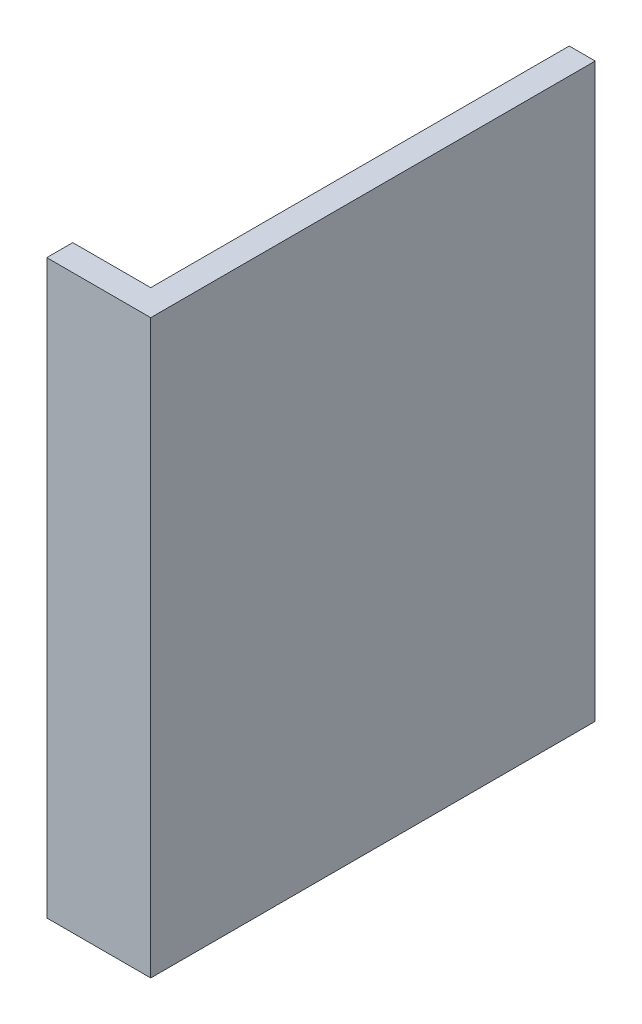
ISO-10303-21;
HEADER;
FILE_DESCRIPTION(('STEP AP214'),'2;1');
FILE_NAME('part.step','',(''),(''),'','','');
FILE_SCHEMA(('AUTOMOTIVE_DESIGN { 1 0 10303 214 1 1 1 1 }'));
ENDSEC;
DATA;
#1=APPLICATION_CONTEXT('core data for automotive mechanical design processes');
#2=APPLICATION_PROTOCOL_DEFINITION('international standard','automotive_design',2000,#1);
#3=PRODUCT_CONTEXT('',#1,'mechanical');
#4=PRODUCT('Part','Part','',(#3));
#5=PRODUCT_RELATED_PRODUCT_CATEGORY('part','',(#4));
#6=PRODUCT_DEFINITION_FORMATION('','',#4);
#7=PRODUCT_DEFINITION_CONTEXT('part definition',#1,'design');
#8=PRODUCT_DEFINITION('design','',#6,#7);
#9=PRODUCT_DEFINITION_SHAPE('','',#8);
#10=(LENGTH_UNIT() NAMED_UNIT(*) SI_UNIT(.MILLI.,.METRE.));
#11=(NAMED_UNIT(*) PLANE_ANGLE_UNIT() SI_UNIT($,.RADIAN.));
#12=(NAMED_UNIT(*) SI_UNIT($,.STERADIAN.) SOLID_ANGLE_UNIT());
#13=UNCERTAINTY_MEASURE_WITH_UNIT(LENGTH_MEASURE(1.E-05),#10,'distance_accuracy_value','');
#14=(GEOMETRIC_REPRESENTATION_CONTEXT(3) GLOBAL_UNCERTAINTY_ASSIGNED_CONTEXT((#13)) GLOBAL_UNIT_ASSIGNED_CONTEXT((#10,
#11,#12)) REPRESENTATION_CONTEXT('',''));
#15=CARTESIAN_POINT('',(0.,0.,0.));
#16=DIRECTION('',(0.,0.,1.));
#17=DIRECTION('',(1.,0.,0.));
#18=AXIS2_PLACEMENT_3D('',#15,#16,#17);
#19=CARTESIAN_POINT('',(-2.,11.,-0.5));
#20=DIRECTION('',(1.,0.,0.));
#21=DIRECTION('',(0.,0.,-1.));
#22=AXIS2_PLACEMENT_3D('',#19,#20,#21);
#23=PLANE('',#22);
#24=DIRECTION('',(0.,0.,1.));
#25=VECTOR('',#24,1.);
#26=CARTESIAN_POINT('',(-2.,0.,-0.5));
#27=LINE('',#26,#25);
#28=CARTESIAN_POINT('',(-2.,0.,-0.5));
#29=VERTEX_POINT('',#28);
#30=CARTESIAN_POINT('',(-2.,0.,0.));
#31=VERTEX_POINT('',#30);
#32=EDGE_CURVE('E128',#29,#31,#27,.T.);
#33=ORIENTED_EDGE('',*,*,#32,.T.);
#34=DIRECTION('',(0.,-1.,0.));
#35=VECTOR('',#34,1.);
#36=CARTESIAN_POINT('',(-2.,11.,0.));
#37=LINE('',#36,#35);
#38=CARTESIAN_POINT('',(-2.,11.,0.));
#39=VERTEX_POINT('',#38);
#40=EDGE_CURVE('E11',#39,#31,#37,.T.);
#41=ORIENTED_EDGE('',*,*,#40,.F.);
#42=DIRECTION('',(0.,0.,1.));
#43=VECTOR('',#42,1.);
#44=CARTESIAN_POINT('',(-2.,11.,-0.5));
#45=LINE('',#44,#43);
#46=CARTESIAN_POINT('',(-2.,11.,-0.5));
#47=VERTEX_POINT('',#46);
#48=EDGE_CURVE('E144',#47,#39,#45,.T.);
#49=ORIENTED_EDGE('',*,*,#48,.F.);
#50=DIRECTION('',(0.,-1.,0.));
#51=VECTOR('',#50,1.);
#52=CARTESIAN_POINT('',(-2.,11.,-0.5));
#53=LINE('',#52,#51);
#54=EDGE_CURVE('E124',#47,#29,#53,.T.);
#55=ORIENTED_EDGE('',*,*,#54,.T.);
#56=EDGE_LOOP('',(#33,#41,#49,#55));
#57=FACE_BOUND('',#56,.T.);
#58=ADVANCED_FACE('F39',(#57),#23,.F.);
#59=CARTESIAN_POINT('',(-2.,11.,0.));
#60=DIRECTION('',(0.,0.,-1.));
#61=DIRECTION('',(-1.,0.,0.));
#62=AXIS2_PLACEMENT_3D('',#59,#60,#61);
#63=PLANE('',#62);
#64=DIRECTION('',(1.,0.,0.));
#65=VECTOR('',#64,1.);
#66=CARTESIAN_POINT('',(-2.,0.,0.));
#67=LINE('',#66,#65);
#68=CARTESIAN_POINT('',(0.,0.,0.));
#69=VERTEX_POINT('',#68);
#70=EDGE_CURVE('E132',#31,#69,#67,.T.);
#71=ORIENTED_EDGE('',*,*,#70,.T.);
#72=DIRECTION('',(0.,-1.,0.));
#73=VECTOR('',#72,1.);
#74=CARTESIAN_POINT('',(0.,11.,0.));
#75=LINE('',#74,#73);
#76=CARTESIAN_POINT('',(0.,11.,0.));
#77=VERTEX_POINT('',#76);
#78=EDGE_CURVE('E48',#77,#69,#75,.T.);
#79=ORIENTED_EDGE('',*,*,#78,.F.);
#80=DIRECTION('',(1.,0.,0.));
#81=VECTOR('',#80,1.);
#82=CARTESIAN_POINT('',(-2.,11.,0.));
#83=LINE('',#82,#81);
#84=EDGE_CURVE('E93',#39,#77,#83,.T.);
#85=ORIENTED_EDGE('',*,*,#84,.F.);
#86=ORIENTED_EDGE('',*,*,#40,.T.);
#87=EDGE_LOOP('',(#71,#79,#85,#86));
#88=FACE_BOUND('',#87,.T.);
#89=ADVANCED_FACE('F172',(#88),#63,.F.);
#90=CARTESIAN_POINT('',(0.,11.,0.));
#91=DIRECTION('',(-1.,0.,0.));
#92=DIRECTION('',(0.,0.,1.));
#93=AXIS2_PLACEMENT_3D('',#90,#91,#92);
#94=PLANE('',#93);
#95=DIRECTION('',(0.,0.,-1.));
#96=VECTOR('',#95,1.);
#97=CARTESIAN_POINT('',(0.,0.,0.));
#98=LINE('',#97,#96);
#99=CARTESIAN_POINT('',(0.,0.,-8.55));
#100=VERTEX_POINT('',#99);
#101=EDGE_CURVE('E135',#69,#100,#98,.T.);
#102=ORIENTED_EDGE('',*,*,#101,.T.);
#103=DIRECTION('',(0.,-1.,0.));
#104=VECTOR('',#103,1.);
#105=CARTESIAN_POINT('',(0.,11.,-8.55));
#106=LINE('',#105,#104);
#107=CARTESIAN_POINT('',(0.,11.,-8.55));
#108=VERTEX_POINT('',#107);
#109=EDGE_CURVE('E117',#108,#100,#106,.T.);
#110=ORIENTED_EDGE('',*,*,#109,.F.);
#111=DIRECTION('',(0.,0.,-1.));
#112=VECTOR('',#111,1.);
#113=CARTESIAN_POINT('',(0.,11.,0.));
#114=LINE('',#113,#112);
#115=EDGE_CURVE('E106',#77,#108,#114,.T.);
#116=ORIENTED_EDGE('',*,*,#115,.F.);
#117=ORIENTED_EDGE('',*,*,#78,.T.);
#118=EDGE_LOOP('',(#102,#110,#116,#117));
#119=FACE_BOUND('',#118,.T.);
#120=ADVANCED_FACE('F154',(#119),#94,.F.);
#121=CARTESIAN_POINT('',(0.,11.,-8.55));
#122=DIRECTION('',(0.,0.,1.));
#123=DIRECTION('',(1.,0.,0.));
#124=AXIS2_PLACEMENT_3D('',#121,#122,#123);
#125=PLANE('',#124);
#126=DIRECTION('',(-1.,0.,0.));
#127=VECTOR('',#126,1.);
#128=CARTESIAN_POINT('',(0.,0.,-8.55));
#129=LINE('',#128,#127);
#130=CARTESIAN_POINT('',(-0.5,0.,-8.55));
#131=VERTEX_POINT('',#130);
#132=EDGE_CURVE('E115',#100,#131,#129,.T.);
#133=ORIENTED_EDGE('',*,*,#132,.T.);
#134=DIRECTION('',(0.,-1.,0.));
#135=VECTOR('',#134,1.);
#136=CARTESIAN_POINT('',(-0.5,11.,-8.55));
#137=LINE('',#136,#135);
#138=CARTESIAN_POINT('',(-0.5,11.,-8.55));
#139=VERTEX_POINT('',#138);
#140=EDGE_CURVE('E112',#139,#131,#137,.T.);
#141=ORIENTED_EDGE('',*,*,#140,.F.);
#142=DIRECTION('',(-1.,0.,0.));
#143=VECTOR('',#142,1.);
#144=CARTESIAN_POINT('',(0.,11.,-8.55));
#145=LINE('',#144,#143);
#146=EDGE_CURVE('E100',#108,#139,#145,.T.);
#147=ORIENTED_EDGE('',*,*,#146,.F.);
#148=ORIENTED_EDGE('',*,*,#109,.T.);
#149=EDGE_LOOP('',(#133,#141,#147,#148));
#150=FACE_BOUND('',#149,.T.);
#151=ADVANCED_FACE('F113',(#150),#125,.F.);
#152=CARTESIAN_POINT('',(-0.5,11.,-8.55));
#153=DIRECTION('',(1.,0.,0.));
#154=DIRECTION('',(0.,0.,-1.));
#155=AXIS2_PLACEMENT_3D('',#152,#153,#154);
#156=PLANE('',#155);
#157=DIRECTION('',(0.,0.,1.));
#158=VECTOR('',#157,1.);
#159=CARTESIAN_POINT('',(-0.5,0.,-8.55));
#160=LINE('',#159,#158);
#161=CARTESIAN_POINT('',(-0.499999999999999,0.,-0.5));
#162=VERTEX_POINT('',#161);
#163=EDGE_CURVE('E79',#131,#162,#160,.T.);
#164=ORIENTED_EDGE('',*,*,#163,.T.);
#165=DIRECTION('',(0.,-1.,0.));
#166=VECTOR('',#165,1.);
#167=CARTESIAN_POINT('',(-0.499999999999999,11.,-0.5));
#168=LINE('',#167,#166);
#169=CARTESIAN_POINT('',(-0.499999999999999,11.,-0.5));
#170=VERTEX_POINT('',#169);
#171=EDGE_CURVE('E118',#170,#162,#168,.T.);
#172=ORIENTED_EDGE('',*,*,#171,.F.);
#173=DIRECTION('',(0.,0.,1.));
#174=VECTOR('',#173,1.);
#175=CARTESIAN_POINT('',(-0.5,11.,-8.55));
#176=LINE('',#175,#174);
#177=EDGE_CURVE('E104',#139,#170,#176,.T.);
#178=ORIENTED_EDGE('',*,*,#177,.F.);
#179=ORIENTED_EDGE('',*,*,#140,.T.);
#180=EDGE_LOOP('',(#164,#172,#178,#179));
#181=FACE_BOUND('',#180,.T.);
#182=ADVANCED_FACE('F120',(#181),#156,.F.);
#183=CARTESIAN_POINT('',(-0.499999999999999,11.,-0.5));
#184=DIRECTION('',(0.,0.,1.));
#185=DIRECTION('',(1.,0.,0.));
#186=AXIS2_PLACEMENT_3D('',#183,#184,#185);
#187=PLANE('',#186);
#188=DIRECTION('',(-1.,0.,0.));
#189=VECTOR('',#188,1.);
#190=CARTESIAN_POINT('',(-0.499999999999999,0.,-0.5));
#191=LINE('',#190,#189);
#192=EDGE_CURVE('E85',#162,#29,#191,.T.);
#193=ORIENTED_EDGE('',*,*,#192,.T.);
#194=ORIENTED_EDGE('',*,*,#54,.F.);
#195=DIRECTION('',(-1.,0.,0.));
#196=VECTOR('',#195,1.);
#197=CARTESIAN_POINT('',(-0.499999999999999,11.,-0.5));
#198=LINE('',#197,#196);
#199=EDGE_CURVE('E56',#170,#47,#198,.T.);
#200=ORIENTED_EDGE('',*,*,#199,.F.);
#201=ORIENTED_EDGE('',*,*,#171,.T.);
#202=EDGE_LOOP('',(#193,#194,#200,#201));
#203=FACE_BOUND('',#202,.T.);
#204=ADVANCED_FACE('F161',(#203),#187,.F.);
#205=CARTESIAN_POINT('',(0.,11.,0.));
#206=DIRECTION('',(0.,1.,0.));
#207=DIRECTION('',(0.,0.,1.));
#208=AXIS2_PLACEMENT_3D('',#205,#206,#207);
#209=PLANE('',#208);
#210=ORIENTED_EDGE('',*,*,#48,.T.);
#211=ORIENTED_EDGE('',*,*,#84,.T.);
#212=ORIENTED_EDGE('',*,*,#115,.T.);
#213=ORIENTED_EDGE('',*,*,#146,.T.);
#214=ORIENTED_EDGE('',*,*,#177,.T.);
#215=ORIENTED_EDGE('',*,*,#199,.T.);
#216=EDGE_LOOP('',(#210,#211,#212,#213,#214,#215));
#217=FACE_BOUND('',#216,.T.);
#218=ADVANCED_FACE('F102',(#217),#209,.T.);
#219=CARTESIAN_POINT('',(0.,0.,0.));
#220=DIRECTION('',(0.,1.,0.));
#221=DIRECTION('',(0.,0.,1.));
#222=AXIS2_PLACEMENT_3D('',#219,#220,#221);
#223=PLANE('',#222);
#224=ORIENTED_EDGE('',*,*,#32,.F.);
#225=ORIENTED_EDGE('',*,*,#192,.F.);
#226=ORIENTED_EDGE('',*,*,#163,.F.);
#227=ORIENTED_EDGE('',*,*,#132,.F.);
#228=ORIENTED_EDGE('',*,*,#101,.F.);
#229=ORIENTED_EDGE('',*,*,#70,.F.);
#230=EDGE_LOOP('',(#224,#225,#226,#227,#228,#229));
#231=FACE_BOUND('',#230,.T.);
#232=ADVANCED_FACE('F157',(#231),#223,.F.);
#233=CLOSED_SHELL('',(#58,#89,#120,#151,#182,#204,#218,#232));
#234=MANIFOLD_SOLID_BREP('B2',#233);
#235=ADVANCED_BREP_SHAPE_REPRESENTATION('',(#18,#234),#14);
#236=SHAPE_DEFINITION_REPRESENTATION(#9,#235);
ENDSEC;
END-ISO-10303-21;
